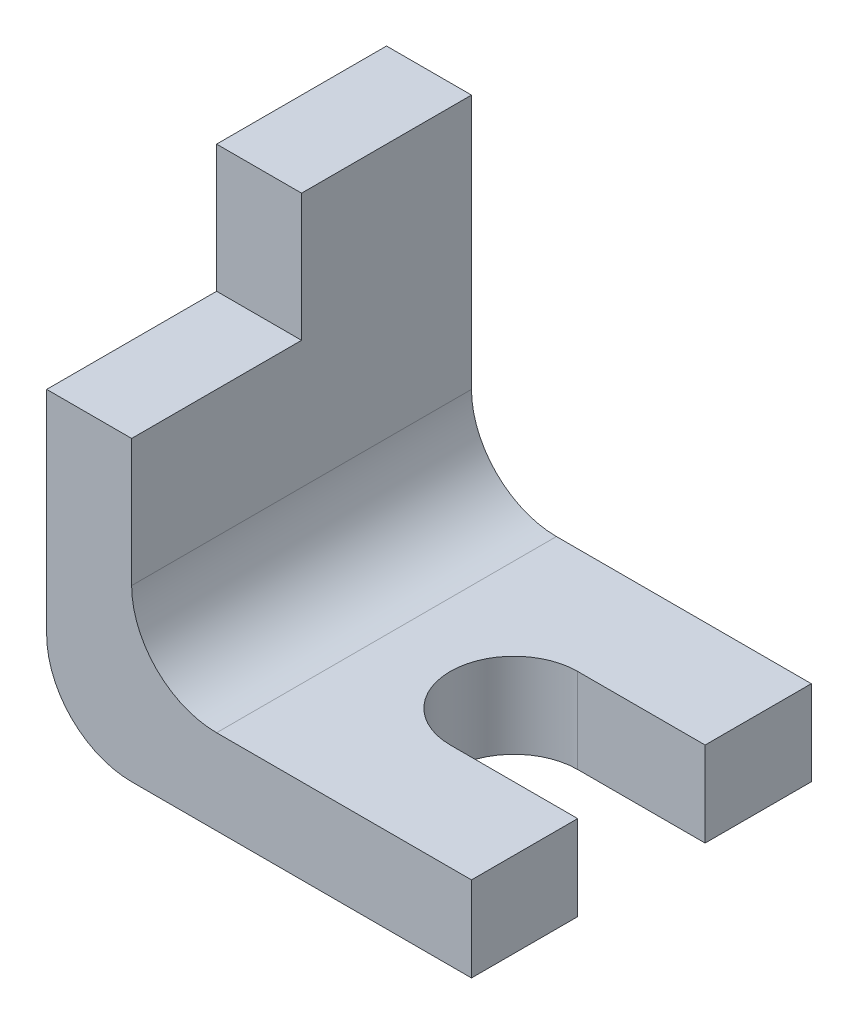
ISO-10303-21;
HEADER;
FILE_DESCRIPTION(('STEP AP214'),'2;1');
FILE_NAME('part.step','',(''),(''),'','','');
FILE_SCHEMA(('AUTOMOTIVE_DESIGN { 1 0 10303 214 1 1 1 1 }'));
ENDSEC;
DATA;
#1=APPLICATION_CONTEXT('core data for automotive mechanical design processes');
#2=APPLICATION_PROTOCOL_DEFINITION('international standard','automotive_design',2000,#1);
#3=PRODUCT_CONTEXT('',#1,'mechanical');
#4=PRODUCT('Part','Part','',(#3));
#5=PRODUCT_RELATED_PRODUCT_CATEGORY('part','',(#4));
#6=PRODUCT_DEFINITION_FORMATION('','',#4);
#7=PRODUCT_DEFINITION_CONTEXT('part definition',#1,'design');
#8=PRODUCT_DEFINITION('design','',#6,#7);
#9=PRODUCT_DEFINITION_SHAPE('','',#8);
#10=(LENGTH_UNIT() NAMED_UNIT(*) SI_UNIT(.MILLI.,.METRE.));
#11=(NAMED_UNIT(*) PLANE_ANGLE_UNIT() SI_UNIT($,.RADIAN.));
#12=(NAMED_UNIT(*) SI_UNIT($,.STERADIAN.) SOLID_ANGLE_UNIT());
#13=UNCERTAINTY_MEASURE_WITH_UNIT(LENGTH_MEASURE(1.E-05),#10,'distance_accuracy_value','');
#14=(GEOMETRIC_REPRESENTATION_CONTEXT(3) GLOBAL_UNCERTAINTY_ASSIGNED_CONTEXT((#13)) GLOBAL_UNIT_ASSIGNED_CONTEXT((#10,
#11,#12)) REPRESENTATION_CONTEXT('',''));
#15=CARTESIAN_POINT('',(0.,0.,0.));
#16=DIRECTION('',(0.,0.,1.));
#17=DIRECTION('',(1.,0.,0.));
#18=AXIS2_PLACEMENT_3D('',#15,#16,#17);
#19=CARTESIAN_POINT('',(50.,0.,40.));
#20=DIRECTION('',(-1.,0.,0.));
#21=DIRECTION('',(0.,0.,1.));
#22=AXIS2_PLACEMENT_3D('',#19,#20,#21);
#23=PLANE('',#22);
#24=DIRECTION('',(0.,-1.,0.));
#25=VECTOR('',#24,1.);
#26=CARTESIAN_POINT('',(50.,13.,27.5));
#27=LINE('',#26,#25);
#28=CARTESIAN_POINT('',(50.,10.,27.5));
#29=VERTEX_POINT('',#28);
#30=CARTESIAN_POINT('',(50.,0.,27.5));
#31=VERTEX_POINT('',#30);
#32=EDGE_CURVE('E195',#29,#31,#27,.T.);
#33=ORIENTED_EDGE('',*,*,#32,.F.);
#34=DIRECTION('',(0.,0.,-1.));
#35=VECTOR('',#34,1.);
#36=CARTESIAN_POINT('',(50.,10.,40.));
#37=LINE('',#36,#35);
#38=CARTESIAN_POINT('',(50.,10.,40.));
#39=VERTEX_POINT('',#38);
#40=EDGE_CURVE('E265',#39,#29,#37,.T.);
#41=ORIENTED_EDGE('',*,*,#40,.F.);
#42=DIRECTION('',(0.,1.,0.));
#43=VECTOR('',#42,1.);
#44=CARTESIAN_POINT('',(50.,0.,40.));
#45=LINE('',#44,#43);
#46=CARTESIAN_POINT('',(50.,0.,40.));
#47=VERTEX_POINT('',#46);
#48=EDGE_CURVE('E237',#47,#39,#45,.T.);
#49=ORIENTED_EDGE('',*,*,#48,.F.);
#50=DIRECTION('',(0.,0.,-1.));
#51=VECTOR('',#50,1.);
#52=CARTESIAN_POINT('',(50.,0.,40.));
#53=LINE('',#52,#51);
#54=EDGE_CURVE('E268',#47,#31,#53,.T.);
#55=ORIENTED_EDGE('',*,*,#54,.T.);
#56=EDGE_LOOP('',(#33,#41,#49,#55));
#57=FACE_BOUND('',#56,.T.);
#58=ADVANCED_FACE('F81',(#57),#23,.F.);
#59=CARTESIAN_POINT('',(10.,20.0000000000001,40.));
#60=DIRECTION('',(-1.,0.,0.));
#61=DIRECTION('',(0.,0.,1.));
#62=AXIS2_PLACEMENT_3D('',#59,#60,#61);
#63=PLANE('',#62);
#64=DIRECTION('',(0.,0.,-1.));
#65=VECTOR('',#64,1.);
#66=CARTESIAN_POINT('',(10.,35.,40.));
#67=LINE('',#66,#65);
#68=CARTESIAN_POINT('',(10.,35.,40.));
#69=VERTEX_POINT('',#68);
#70=CARTESIAN_POINT('',(10.,35.,20.));
#71=VERTEX_POINT('',#70);
#72=EDGE_CURVE('E208',#69,#71,#67,.T.);
#73=ORIENTED_EDGE('',*,*,#72,.F.);
#74=DIRECTION('',(0.,1.,0.));
#75=VECTOR('',#74,1.);
#76=CARTESIAN_POINT('',(10.,20.0000000000001,40.));
#77=LINE('',#76,#75);
#78=CARTESIAN_POINT('',(10.,20.0000000000001,40.));
#79=VERTEX_POINT('',#78);
#80=EDGE_CURVE('E226',#79,#69,#77,.T.);
#81=ORIENTED_EDGE('',*,*,#80,.F.);
#82=DIRECTION('',(0.,0.,-1.));
#83=VECTOR('',#82,1.);
#84=CARTESIAN_POINT('',(10.,20.0000000000001,40.));
#85=LINE('',#84,#83);
#86=CARTESIAN_POINT('',(10.,20.0000000000001,0.));
#87=VERTEX_POINT('',#86);
#88=EDGE_CURVE('E280',#79,#87,#85,.T.);
#89=ORIENTED_EDGE('',*,*,#88,.T.);
#90=DIRECTION('',(0.,1.,0.));
#91=VECTOR('',#90,1.);
#92=CARTESIAN_POINT('',(10.,20.0000000000001,0.));
#93=LINE('',#92,#91);
#94=CARTESIAN_POINT('',(10.,50.,0.));
#95=VERTEX_POINT('',#94);
#96=EDGE_CURVE('E245',#87,#95,#93,.T.);
#97=ORIENTED_EDGE('',*,*,#96,.T.);
#98=DIRECTION('',(0.,0.,-1.));
#99=VECTOR('',#98,1.);
#100=CARTESIAN_POINT('',(10.,50.,40.));
#101=LINE('',#100,#99);
#102=CARTESIAN_POINT('',(10.,50.,20.));
#103=VERTEX_POINT('',#102);
#104=EDGE_CURVE('E278',#103,#95,#101,.T.);
#105=ORIENTED_EDGE('',*,*,#104,.F.);
#106=DIRECTION('',(0.,1.,0.));
#107=VECTOR('',#106,1.);
#108=CARTESIAN_POINT('',(10.,50.,20.));
#109=LINE('',#108,#107);
#110=EDGE_CURVE('E210',#71,#103,#109,.T.);
#111=ORIENTED_EDGE('',*,*,#110,.F.);
#112=EDGE_LOOP('',(#73,#81,#89,#97,#105,#111));
#113=FACE_BOUND('',#112,.T.);
#114=ADVANCED_FACE('F323',(#113),#63,.F.);
#115=CARTESIAN_POINT('',(0.,50.,40.));
#116=DIRECTION('',(0.,1.,0.));
#117=DIRECTION('',(0.,0.,1.));
#118=AXIS2_PLACEMENT_3D('',#115,#116,#117);
#119=PLANE('',#118);
#120=DIRECTION('',(0.,0.,-1.));
#121=VECTOR('',#120,1.);
#122=CARTESIAN_POINT('',(0.,50.,40.));
#123=LINE('',#122,#121);
#124=CARTESIAN_POINT('',(0.,50.,20.));
#125=VERTEX_POINT('',#124);
#126=CARTESIAN_POINT('',(0.,50.,0.));
#127=VERTEX_POINT('',#126);
#128=EDGE_CURVE('E276',#125,#127,#123,.T.);
#129=ORIENTED_EDGE('',*,*,#128,.F.);
#130=DIRECTION('',(-1.,0.,0.));
#131=VECTOR('',#130,1.);
#132=CARTESIAN_POINT('',(10.,50.,20.));
#133=LINE('',#132,#131);
#134=EDGE_CURVE('E213',#103,#125,#133,.T.);
#135=ORIENTED_EDGE('',*,*,#134,.F.);
#136=ORIENTED_EDGE('',*,*,#104,.T.);
#137=DIRECTION('',(1.,0.,0.));
#138=VECTOR('',#137,1.);
#139=CARTESIAN_POINT('',(0.,50.,0.));
#140=LINE('',#139,#138);
#141=EDGE_CURVE('E248',#127,#95,#140,.T.);
#142=ORIENTED_EDGE('',*,*,#141,.F.);
#143=EDGE_LOOP('',(#129,#135,#136,#142));
#144=FACE_BOUND('',#143,.T.);
#145=ADVANCED_FACE('F317',(#144),#119,.T.);
#146=CARTESIAN_POINT('',(0.,10.0000000000001,40.));
#147=DIRECTION('',(-1.,0.,0.));
#148=DIRECTION('',(0.,0.,1.));
#149=AXIS2_PLACEMENT_3D('',#146,#147,#148);
#150=PLANE('',#149);
#151=DIRECTION('',(0.,1.,0.));
#152=VECTOR('',#151,1.);
#153=CARTESIAN_POINT('',(0.,10.0000000000001,40.));
#154=LINE('',#153,#152);
#155=CARTESIAN_POINT('',(0.,10.0000000000001,40.));
#156=VERTEX_POINT('',#155);
#157=CARTESIAN_POINT('',(0.,35.,40.));
#158=VERTEX_POINT('',#157);
#159=EDGE_CURVE('E230',#156,#158,#154,.T.);
#160=ORIENTED_EDGE('',*,*,#159,.T.);
#161=DIRECTION('',(0.,0.,-1.));
#162=VECTOR('',#161,1.);
#163=CARTESIAN_POINT('',(0.,35.,40.));
#164=LINE('',#163,#162);
#165=CARTESIAN_POINT('',(0.,35.,20.));
#166=VERTEX_POINT('',#165);
#167=EDGE_CURVE('E104',#158,#166,#164,.T.);
#168=ORIENTED_EDGE('',*,*,#167,.T.);
#169=DIRECTION('',(0.,1.,0.));
#170=VECTOR('',#169,1.);
#171=CARTESIAN_POINT('',(0.,50.,20.));
#172=LINE('',#171,#170);
#173=EDGE_CURVE('E211',#166,#125,#172,.T.);
#174=ORIENTED_EDGE('',*,*,#173,.T.);
#175=ORIENTED_EDGE('',*,*,#128,.T.);
#176=DIRECTION('',(0.,1.,0.));
#177=VECTOR('',#176,1.);
#178=CARTESIAN_POINT('',(0.,10.0000000000001,0.));
#179=LINE('',#178,#177);
#180=CARTESIAN_POINT('',(0.,10.0000000000001,0.));
#181=VERTEX_POINT('',#180);
#182=EDGE_CURVE('E251',#181,#127,#179,.T.);
#183=ORIENTED_EDGE('',*,*,#182,.F.);
#184=DIRECTION('',(0.,0.,-1.));
#185=VECTOR('',#184,1.);
#186=CARTESIAN_POINT('',(0.,10.0000000000001,40.));
#187=LINE('',#186,#185);
#188=EDGE_CURVE('E274',#156,#181,#187,.T.);
#189=ORIENTED_EDGE('',*,*,#188,.F.);
#190=EDGE_LOOP('',(#160,#168,#174,#175,#183,#189));
#191=FACE_BOUND('',#190,.T.);
#192=ADVANCED_FACE('F311',(#191),#150,.T.);
#193=CARTESIAN_POINT('',(20.,20.,40.));
#194=DIRECTION('',(0.,0.,-1.));
#195=DIRECTION('',(-1.,0.,0.));
#196=AXIS2_PLACEMENT_3D('',#193,#194,#195);
#197=PLANE('',#196);
#198=DIRECTION('',(-1.,0.,0.));
#199=VECTOR('',#198,1.);
#200=CARTESIAN_POINT('',(10.,35.,40.));
#201=LINE('',#200,#199);
#202=EDGE_CURVE('E220',#69,#158,#201,.T.);
#203=ORIENTED_EDGE('',*,*,#202,.T.);
#204=ORIENTED_EDGE('',*,*,#159,.F.);
#205=CARTESIAN_POINT('',(10.,10.,40.));
#206=DIRECTION('',(0.,0.,1.));
#207=DIRECTION('',(1.,0.,0.));
#208=AXIS2_PLACEMENT_3D('',#205,#206,#207);
#209=CIRCLE('',#208,10.);
#210=CARTESIAN_POINT('',(10.0000000000001,0.,40.));
#211=VERTEX_POINT('',#210);
#212=EDGE_CURVE('E233',#156,#211,#209,.T.);
#213=ORIENTED_EDGE('',*,*,#212,.T.);
#214=DIRECTION('',(1.,0.,0.));
#215=VECTOR('',#214,1.);
#216=CARTESIAN_POINT('',(10.0000000000001,0.,40.));
#217=LINE('',#216,#215);
#218=EDGE_CURVE('E235',#211,#47,#217,.T.);
#219=ORIENTED_EDGE('',*,*,#218,.T.);
#220=ORIENTED_EDGE('',*,*,#48,.T.);
#221=DIRECTION('',(1.,0.,0.));
#222=VECTOR('',#221,1.);
#223=CARTESIAN_POINT('',(20.0000000000001,10.,40.));
#224=LINE('',#223,#222);
#225=CARTESIAN_POINT('',(20.0000000000001,10.,40.));
#226=VERTEX_POINT('',#225);
#227=EDGE_CURVE('E239',#226,#39,#224,.T.);
#228=ORIENTED_EDGE('',*,*,#227,.F.);
#229=CARTESIAN_POINT('',(20.,20.,40.));
#230=DIRECTION('',(0.,0.,-1.));
#231=DIRECTION('',(-1.,0.,0.));
#232=AXIS2_PLACEMENT_3D('',#229,#230,#231);
#233=CIRCLE('',#232,10.);
#234=EDGE_CURVE('E223',#226,#79,#233,.T.);
#235=ORIENTED_EDGE('',*,*,#234,.T.);
#236=ORIENTED_EDGE('',*,*,#80,.T.);
#237=EDGE_LOOP('',(#203,#204,#213,#219,#220,#228,#235,#236));
#238=FACE_BOUND('',#237,.T.);
#239=ADVANCED_FACE('F298',(#238),#197,.F.);
#240=CARTESIAN_POINT('',(20.,20.,40.));
#241=DIRECTION('',(0.,0.,-1.));
#242=DIRECTION('',(-1.,0.,0.));
#243=AXIS2_PLACEMENT_3D('',#240,#241,#242);
#244=CYLINDRICAL_SURFACE('',#243,10.);
#245=CARTESIAN_POINT('',(20.,20.,0.));
#246=DIRECTION('',(0.,0.,-1.));
#247=DIRECTION('',(-1.,0.,0.));
#248=AXIS2_PLACEMENT_3D('',#245,#246,#247);
#249=CIRCLE('',#248,10.);
#250=CARTESIAN_POINT('',(20.0000000000001,10.,0.));
#251=VERTEX_POINT('',#250);
#252=EDGE_CURVE('E222',#251,#87,#249,.T.);
#253=ORIENTED_EDGE('',*,*,#252,.T.);
#254=ORIENTED_EDGE('',*,*,#88,.F.);
#255=ORIENTED_EDGE('',*,*,#234,.F.);
#256=DIRECTION('',(0.,0.,-1.));
#257=VECTOR('',#256,1.);
#258=CARTESIAN_POINT('',(20.0000000000001,10.,40.));
#259=LINE('',#258,#257);
#260=EDGE_CURVE('E242',#226,#251,#259,.T.);
#261=ORIENTED_EDGE('',*,*,#260,.T.);
#262=EDGE_LOOP('',(#253,#254,#255,#261));
#263=FACE_BOUND('',#262,.T.);
#264=ADVANCED_FACE('F83',(#263),#244,.F.);
#265=CARTESIAN_POINT('',(10.,10.,40.));
#266=DIRECTION('',(0.,0.,-1.));
#267=DIRECTION('',(-1.,0.,0.));
#268=AXIS2_PLACEMENT_3D('',#265,#266,#267);
#269=CYLINDRICAL_SURFACE('',#268,10.);
#270=CARTESIAN_POINT('',(10.,10.,0.));
#271=DIRECTION('',(0.,0.,1.));
#272=DIRECTION('',(1.,0.,0.));
#273=AXIS2_PLACEMENT_3D('',#270,#271,#272);
#274=CIRCLE('',#273,10.);
#275=CARTESIAN_POINT('',(10.0000000000001,0.,0.));
#276=VERTEX_POINT('',#275);
#277=EDGE_CURVE('E254',#181,#276,#274,.T.);
#278=ORIENTED_EDGE('',*,*,#277,.T.);
#279=DIRECTION('',(0.,0.,-1.));
#280=VECTOR('',#279,1.);
#281=CARTESIAN_POINT('',(10.0000000000001,0.,40.));
#282=LINE('',#281,#280);
#283=EDGE_CURVE('E271',#211,#276,#282,.T.);
#284=ORIENTED_EDGE('',*,*,#283,.F.);
#285=ORIENTED_EDGE('',*,*,#212,.F.);
#286=ORIENTED_EDGE('',*,*,#188,.T.);
#287=EDGE_LOOP('',(#278,#284,#285,#286));
#288=FACE_BOUND('',#287,.T.);
#289=ADVANCED_FACE('F303',(#288),#269,.T.);
#290=CARTESIAN_POINT('',(10.0000000000001,0.,40.));
#291=DIRECTION('',(0.,1.,0.));
#292=DIRECTION('',(0.,0.,1.));
#293=AXIS2_PLACEMENT_3D('',#290,#291,#292);
#294=PLANE('',#293);
#295=CARTESIAN_POINT('',(50.,0.,12.5));
#296=VERTEX_POINT('',#295);
#297=CARTESIAN_POINT('',(50.,0.,0.));
#298=VERTEX_POINT('',#297);
#299=EDGE_CURVE('E200',#296,#298,#53,.T.);
#300=ORIENTED_EDGE('',*,*,#299,.F.);
#301=DIRECTION('',(1.,0.,0.));
#302=VECTOR('',#301,1.);
#303=CARTESIAN_POINT('',(35.,0.,12.5));
#304=LINE('',#303,#302);
#305=CARTESIAN_POINT('',(35.,0.,12.5));
#306=VERTEX_POINT('',#305);
#307=EDGE_CURVE('E184',#306,#296,#304,.T.);
#308=ORIENTED_EDGE('',*,*,#307,.F.);
#309=CARTESIAN_POINT('',(35.,0.,20.));
#310=DIRECTION('',(0.,1.,0.));
#311=DIRECTION('',(0.,0.,1.));
#312=AXIS2_PLACEMENT_3D('',#309,#310,#311);
#313=CIRCLE('',#312,7.5);
#314=CARTESIAN_POINT('',(35.,0.,27.5));
#315=VERTEX_POINT('',#314);
#316=EDGE_CURVE('E191',#306,#315,#313,.T.);
#317=ORIENTED_EDGE('',*,*,#316,.T.);
#318=DIRECTION('',(1.,0.,0.));
#319=VECTOR('',#318,1.);
#320=CARTESIAN_POINT('',(35.,0.,27.5));
#321=LINE('',#320,#319);
#322=EDGE_CURVE('E202',#315,#31,#321,.T.);
#323=ORIENTED_EDGE('',*,*,#322,.T.);
#324=ORIENTED_EDGE('',*,*,#54,.F.);
#325=ORIENTED_EDGE('',*,*,#218,.F.);
#326=ORIENTED_EDGE('',*,*,#283,.T.);
#327=DIRECTION('',(1.,0.,0.));
#328=VECTOR('',#327,1.);
#329=CARTESIAN_POINT('',(10.0000000000001,0.,0.));
#330=LINE('',#329,#328);
#331=EDGE_CURVE('E256',#276,#298,#330,.T.);
#332=ORIENTED_EDGE('',*,*,#331,.T.);
#333=EDGE_LOOP('',(#300,#308,#317,#323,#324,#325,#326,#332));
#334=FACE_BOUND('',#333,.T.);
#335=ADVANCED_FACE('F198',(#334),#294,.F.);
#336=CARTESIAN_POINT('',(50.,10.,12.5));
#337=VERTEX_POINT('',#336);
#338=CARTESIAN_POINT('',(50.,10.,0.));
#339=VERTEX_POINT('',#338);
#340=EDGE_CURVE('E264',#337,#339,#37,.T.);
#341=ORIENTED_EDGE('',*,*,#340,.F.);
#342=DIRECTION('',(0.,-1.,0.));
#343=VECTOR('',#342,1.);
#344=CARTESIAN_POINT('',(50.,13.,12.5));
#345=LINE('',#344,#343);
#346=EDGE_CURVE('E201',#337,#296,#345,.T.);
#347=ORIENTED_EDGE('',*,*,#346,.T.);
#348=ORIENTED_EDGE('',*,*,#299,.T.);
#349=DIRECTION('',(0.,1.,0.));
#350=VECTOR('',#349,1.);
#351=CARTESIAN_POINT('',(50.,0.,0.));
#352=LINE('',#351,#350);
#353=EDGE_CURVE('E258',#298,#339,#352,.T.);
#354=ORIENTED_EDGE('',*,*,#353,.T.);
#355=EDGE_LOOP('',(#341,#347,#348,#354));
#356=FACE_BOUND('',#355,.T.);
#357=ADVANCED_FACE('F327',(#356),#23,.F.);
#358=CARTESIAN_POINT('',(20.0000000000001,10.,40.));
#359=DIRECTION('',(0.,1.,0.));
#360=DIRECTION('',(0.,0.,1.));
#361=AXIS2_PLACEMENT_3D('',#358,#359,#360);
#362=PLANE('',#361);
#363=DIRECTION('',(-1.,0.,0.));
#364=VECTOR('',#363,1.);
#365=CARTESIAN_POINT('',(20.0000000000001,10.,12.5));
#366=LINE('',#365,#364);
#367=CARTESIAN_POINT('',(35.,10.,12.5));
#368=VERTEX_POINT('',#367);
#369=EDGE_CURVE('E12',#337,#368,#366,.T.);
#370=ORIENTED_EDGE('',*,*,#369,.F.);
#371=ORIENTED_EDGE('',*,*,#340,.T.);
#372=DIRECTION('',(1.,0.,0.));
#373=VECTOR('',#372,1.);
#374=CARTESIAN_POINT('',(20.0000000000001,10.,0.));
#375=LINE('',#374,#373);
#376=EDGE_CURVE('E227',#251,#339,#375,.T.);
#377=ORIENTED_EDGE('',*,*,#376,.F.);
#378=ORIENTED_EDGE('',*,*,#260,.F.);
#379=ORIENTED_EDGE('',*,*,#227,.T.);
#380=ORIENTED_EDGE('',*,*,#40,.T.);
#381=DIRECTION('',(-1.,0.,0.));
#382=VECTOR('',#381,1.);
#383=CARTESIAN_POINT('',(20.0000000000001,10.,27.5));
#384=LINE('',#383,#382);
#385=CARTESIAN_POINT('',(35.,10.,27.5));
#386=VERTEX_POINT('',#385);
#387=EDGE_CURVE('E283',#29,#386,#384,.T.);
#388=ORIENTED_EDGE('',*,*,#387,.T.);
#389=CARTESIAN_POINT('',(35.,10.,20.));
#390=DIRECTION('',(0.,1.,0.));
#391=DIRECTION('',(0.,0.,1.));
#392=AXIS2_PLACEMENT_3D('',#389,#390,#391);
#393=CIRCLE('',#392,7.5);
#394=EDGE_CURVE('E89',#386,#368,#393,.F.);
#395=ORIENTED_EDGE('',*,*,#394,.T.);
#396=EDGE_LOOP('',(#370,#371,#377,#378,#379,#380,#388,#395));
#397=FACE_BOUND('',#396,.T.);
#398=ADVANCED_FACE('F286',(#397),#362,.T.);
#399=CARTESIAN_POINT('',(20.,20.,0.));
#400=DIRECTION('',(0.,0.,-1.));
#401=DIRECTION('',(-1.,0.,0.));
#402=AXIS2_PLACEMENT_3D('',#399,#400,#401);
#403=PLANE('',#402);
#404=ORIENTED_EDGE('',*,*,#252,.F.);
#405=ORIENTED_EDGE('',*,*,#376,.T.);
#406=ORIENTED_EDGE('',*,*,#353,.F.);
#407=ORIENTED_EDGE('',*,*,#331,.F.);
#408=ORIENTED_EDGE('',*,*,#277,.F.);
#409=ORIENTED_EDGE('',*,*,#182,.T.);
#410=ORIENTED_EDGE('',*,*,#141,.T.);
#411=ORIENTED_EDGE('',*,*,#96,.F.);
#412=EDGE_LOOP('',(#404,#405,#406,#407,#408,#409,#410,#411));
#413=FACE_BOUND('',#412,.T.);
#414=ADVANCED_FACE('F308',(#413),#403,.T.);
#415=CARTESIAN_POINT('',(10.,35.,40.));
#416=DIRECTION('',(0.,1.,0.));
#417=DIRECTION('',(0.,0.,1.));
#418=AXIS2_PLACEMENT_3D('',#415,#416,#417);
#419=PLANE('',#418);
#420=ORIENTED_EDGE('',*,*,#167,.F.);
#421=ORIENTED_EDGE('',*,*,#202,.F.);
#422=ORIENTED_EDGE('',*,*,#72,.T.);
#423=DIRECTION('',(-1.,0.,0.));
#424=VECTOR('',#423,1.);
#425=CARTESIAN_POINT('',(10.,35.,20.));
#426=LINE('',#425,#424);
#427=EDGE_CURVE('E218',#71,#166,#426,.T.);
#428=ORIENTED_EDGE('',*,*,#427,.T.);
#429=EDGE_LOOP('',(#420,#421,#422,#428));
#430=FACE_BOUND('',#429,.T.);
#431=ADVANCED_FACE('F359',(#430),#419,.T.);
#432=CARTESIAN_POINT('',(10.,50.,20.));
#433=DIRECTION('',(0.,0.,1.));
#434=DIRECTION('',(1.,0.,0.));
#435=AXIS2_PLACEMENT_3D('',#432,#433,#434);
#436=PLANE('',#435);
#437=ORIENTED_EDGE('',*,*,#173,.F.);
#438=ORIENTED_EDGE('',*,*,#427,.F.);
#439=ORIENTED_EDGE('',*,*,#110,.T.);
#440=ORIENTED_EDGE('',*,*,#134,.T.);
#441=EDGE_LOOP('',(#437,#438,#439,#440));
#442=FACE_BOUND('',#441,.T.);
#443=ADVANCED_FACE('F365',(#442),#436,.T.);
#444=CARTESIAN_POINT('',(35.,13.,20.));
#445=DIRECTION('',(0.,-1.,0.));
#446=DIRECTION('',(0.,0.,-1.));
#447=AXIS2_PLACEMENT_3D('',#444,#445,#446);
#448=CYLINDRICAL_SURFACE('',#447,7.5);
#449=DIRECTION('',(0.,-1.,0.));
#450=VECTOR('',#449,1.);
#451=CARTESIAN_POINT('',(35.,13.,27.5));
#452=LINE('',#451,#450);
#453=EDGE_CURVE('E96',#386,#315,#452,.T.);
#454=ORIENTED_EDGE('',*,*,#453,.T.);
#455=ORIENTED_EDGE('',*,*,#316,.F.);
#456=DIRECTION('',(0.,-1.,0.));
#457=VECTOR('',#456,1.);
#458=CARTESIAN_POINT('',(35.,13.,12.5));
#459=LINE('',#458,#457);
#460=EDGE_CURVE('E180',#368,#306,#459,.T.);
#461=ORIENTED_EDGE('',*,*,#460,.F.);
#462=ORIENTED_EDGE('',*,*,#394,.F.);
#463=EDGE_LOOP('',(#454,#455,#461,#462));
#464=FACE_BOUND('',#463,.T.);
#465=ADVANCED_FACE('F192',(#464),#448,.F.);
#466=CARTESIAN_POINT('',(35.,13.,12.5));
#467=DIRECTION('',(0.,0.,-1.));
#468=DIRECTION('',(-1.,0.,0.));
#469=AXIS2_PLACEMENT_3D('',#466,#467,#468);
#470=PLANE('',#469);
#471=ORIENTED_EDGE('',*,*,#369,.T.);
#472=ORIENTED_EDGE('',*,*,#460,.T.);
#473=ORIENTED_EDGE('',*,*,#307,.T.);
#474=ORIENTED_EDGE('',*,*,#346,.F.);
#475=EDGE_LOOP('',(#471,#472,#473,#474));
#476=FACE_BOUND('',#475,.T.);
#477=ADVANCED_FACE('F182',(#476),#470,.F.);
#478=CARTESIAN_POINT('',(35.,13.,27.5));
#479=DIRECTION('',(0.,0.,-1.));
#480=DIRECTION('',(-1.,0.,0.));
#481=AXIS2_PLACEMENT_3D('',#478,#479,#480);
#482=PLANE('',#481);
#483=ORIENTED_EDGE('',*,*,#32,.T.);
#484=ORIENTED_EDGE('',*,*,#322,.F.);
#485=ORIENTED_EDGE('',*,*,#453,.F.);
#486=ORIENTED_EDGE('',*,*,#387,.F.);
#487=EDGE_LOOP('',(#483,#484,#485,#486));
#488=FACE_BOUND('',#487,.T.);
#489=ADVANCED_FACE('F290',(#488),#482,.T.);
#490=CLOSED_SHELL('',(#58,#114,#145,#192,#239,#264,#289,#335,#357,#398,#414,#431,#443,#465,#477,#489));
#491=MANIFOLD_SOLID_BREP('B2',#490);
#492=ADVANCED_BREP_SHAPE_REPRESENTATION('',(#18,#491),#14);
#493=SHAPE_DEFINITION_REPRESENTATION(#9,#492);
ENDSEC;
END-ISO-10303-21;
